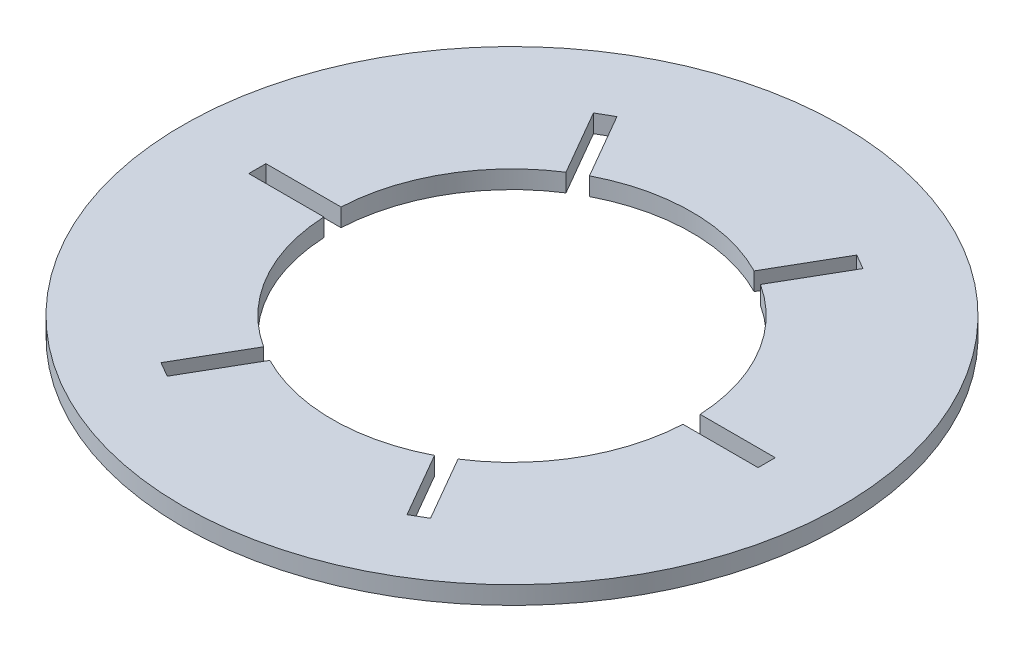
ISO-10303-21;
HEADER;
FILE_DESCRIPTION(('STEP AP214'),'2;1');
FILE_NAME('part.step','',(''),(''),'','','');
FILE_SCHEMA(('AUTOMOTIVE_DESIGN { 1 0 10303 214 1 1 1 1 }'));
ENDSEC;
DATA;
#1=APPLICATION_CONTEXT('core data for automotive mechanical design processes');
#2=APPLICATION_PROTOCOL_DEFINITION('international standard','automotive_design',2000,#1);
#3=PRODUCT_CONTEXT('',#1,'mechanical');
#4=PRODUCT('Part','Part','',(#3));
#5=PRODUCT_RELATED_PRODUCT_CATEGORY('part','',(#4));
#6=PRODUCT_DEFINITION_FORMATION('','',#4);
#7=PRODUCT_DEFINITION_CONTEXT('part definition',#1,'design');
#8=PRODUCT_DEFINITION('design','',#6,#7);
#9=PRODUCT_DEFINITION_SHAPE('','',#8);
#10=(LENGTH_UNIT() NAMED_UNIT(*) SI_UNIT(.MILLI.,.METRE.));
#11=(NAMED_UNIT(*) PLANE_ANGLE_UNIT() SI_UNIT($,.RADIAN.));
#12=(NAMED_UNIT(*) SI_UNIT($,.STERADIAN.) SOLID_ANGLE_UNIT());
#13=UNCERTAINTY_MEASURE_WITH_UNIT(LENGTH_MEASURE(1.E-05),#10,'distance_accuracy_value','');
#14=(GEOMETRIC_REPRESENTATION_CONTEXT(3) GLOBAL_UNCERTAINTY_ASSIGNED_CONTEXT((#13)) GLOBAL_UNIT_ASSIGNED_CONTEXT((#10,
#11,#12)) REPRESENTATION_CONTEXT('',''));
#15=CARTESIAN_POINT('',(0.,0.,0.));
#16=DIRECTION('',(0.,0.,1.));
#17=DIRECTION('',(1.,0.,0.));
#18=AXIS2_PLACEMENT_3D('',#15,#16,#17);
#19=CARTESIAN_POINT('',(0.,0.,0.));
#20=DIRECTION('',(0.,1.,0.));
#21=DIRECTION('',(0.,0.,1.));
#22=AXIS2_PLACEMENT_3D('',#19,#20,#21);
#23=CYLINDRICAL_SURFACE('',#22,30.);
#24=CARTESIAN_POINT('',(0.,0.,0.));
#25=DIRECTION('',(0.,1.,0.));
#26=DIRECTION('',(0.,0.,1.));
#27=AXIS2_PLACEMENT_3D('',#24,#25,#26);
#28=CIRCLE('',#27,30.);
#29=CARTESIAN_POINT('',(-16.2255764190939,0.,-25.2335227399613));
#30=VERTEX_POINT('',#29);
#31=CARTESIAN_POINT('',(-29.9656599293258,0.,-1.43499999999999));
#32=VERTEX_POINT('',#31);
#33=EDGE_CURVE('E334',#30,#32,#28,.T.);
#34=ORIENTED_EDGE('',*,*,#33,.F.);
#35=DIRECTION('',(0.,1.,0.));
#36=VECTOR('',#35,1.);
#37=CARTESIAN_POINT('',(-16.2255764190939,0.,-25.2335227399613));
#38=LINE('',#37,#36);
#39=CARTESIAN_POINT('',(-16.2255764190939,3.,-25.2335227399613));
#40=VERTEX_POINT('',#39);
#41=EDGE_CURVE('E11',#30,#40,#38,.T.);
#42=ORIENTED_EDGE('',*,*,#41,.T.);
#43=CARTESIAN_POINT('',(0.,3.,0.));
#44=DIRECTION('',(0.,1.,0.));
#45=DIRECTION('',(0.,0.,1.));
#46=AXIS2_PLACEMENT_3D('',#43,#44,#45);
#47=CIRCLE('',#46,30.);
#48=CARTESIAN_POINT('',(-29.9656599293258,3.,-1.43499999999999));
#49=VERTEX_POINT('',#48);
#50=EDGE_CURVE('E327',#40,#49,#47,.T.);
#51=ORIENTED_EDGE('',*,*,#50,.T.);
#52=DIRECTION('',(0.,1.,0.));
#53=VECTOR('',#52,1.);
#54=CARTESIAN_POINT('',(-29.9656599293258,0.,-1.43499999999999));
#55=LINE('',#54,#53);
#56=EDGE_CURVE('E342',#49,#32,#55,.F.);
#57=ORIENTED_EDGE('',*,*,#56,.T.);
#58=EDGE_LOOP('',(#34,#42,#51,#57));
#59=FACE_BOUND('',#58,.T.);
#60=ADVANCED_FACE('F33',(#59),#23,.F.);
#61=CARTESIAN_POINT('',(13.740083510232,3.,-26.6685227399617));
#62=VERTEX_POINT('',#61);
#63=CARTESIAN_POINT('',(-13.7400835102325,3.,-26.6685227399614));
#64=VERTEX_POINT('',#63);
#65=EDGE_CURVE('E378',#62,#64,#47,.T.);
#66=ORIENTED_EDGE('',*,*,#65,.T.);
#67=DIRECTION('',(0.,1.,0.));
#68=VECTOR('',#67,1.);
#69=CARTESIAN_POINT('',(-13.7400835102325,0.,-26.6685227399614));
#70=LINE('',#69,#68);
#71=CARTESIAN_POINT('',(-13.7400835102325,0.,-26.6685227399614));
#72=VERTEX_POINT('',#71);
#73=EDGE_CURVE('E41',#64,#72,#70,.F.);
#74=ORIENTED_EDGE('',*,*,#73,.T.);
#75=CARTESIAN_POINT('',(13.740083510232,0.,-26.6685227399617));
#76=VERTEX_POINT('',#75);
#77=EDGE_CURVE('E376',#76,#72,#28,.T.);
#78=ORIENTED_EDGE('',*,*,#77,.F.);
#79=DIRECTION('',(0.,1.,0.));
#80=VECTOR('',#79,1.);
#81=CARTESIAN_POINT('',(13.740083510232,0.,-26.6685227399617));
#82=LINE('',#81,#80);
#83=EDGE_CURVE('E369',#76,#62,#82,.T.);
#84=ORIENTED_EDGE('',*,*,#83,.T.);
#85=EDGE_LOOP('',(#66,#74,#78,#84));
#86=FACE_BOUND('',#85,.T.);
#87=ADVANCED_FACE('F375',(#86),#23,.F.);
#88=CARTESIAN_POINT('',(29.9656599293258,3.,-1.43500000000001));
#89=VERTEX_POINT('',#88);
#90=CARTESIAN_POINT('',(16.2255764190933,3.,-25.2335227399617));
#91=VERTEX_POINT('',#90);
#92=EDGE_CURVE('E396',#89,#91,#47,.T.);
#93=ORIENTED_EDGE('',*,*,#92,.T.);
#94=DIRECTION('',(0.,1.,0.));
#95=VECTOR('',#94,1.);
#96=CARTESIAN_POINT('',(16.2255764190933,0.,-25.2335227399617));
#97=LINE('',#96,#95);
#98=CARTESIAN_POINT('',(16.2255764190933,0.,-25.2335227399617));
#99=VERTEX_POINT('',#98);
#100=EDGE_CURVE('E367',#91,#99,#97,.F.);
#101=ORIENTED_EDGE('',*,*,#100,.T.);
#102=CARTESIAN_POINT('',(29.9656599293258,0.,-1.43500000000001));
#103=VERTEX_POINT('',#102);
#104=EDGE_CURVE('E381',#103,#99,#28,.T.);
#105=ORIENTED_EDGE('',*,*,#104,.F.);
#106=DIRECTION('',(0.,1.,0.));
#107=VECTOR('',#106,1.);
#108=CARTESIAN_POINT('',(29.9656599293258,0.,-1.43500000000001));
#109=LINE('',#108,#107);
#110=EDGE_CURVE('E364',#103,#89,#109,.T.);
#111=ORIENTED_EDGE('',*,*,#110,.T.);
#112=EDGE_LOOP('',(#93,#101,#105,#111));
#113=FACE_BOUND('',#112,.T.);
#114=ADVANCED_FACE('F430',(#113),#23,.F.);
#115=CARTESIAN_POINT('',(16.2255764190937,3.,25.2335227399614));
#116=VERTEX_POINT('',#115);
#117=CARTESIAN_POINT('',(29.9656599293258,3.,1.43499999999999));
#118=VERTEX_POINT('',#117);
#119=EDGE_CURVE('E398',#116,#118,#47,.T.);
#120=ORIENTED_EDGE('',*,*,#119,.T.);
#121=DIRECTION('',(0.,1.,0.));
#122=VECTOR('',#121,1.);
#123=CARTESIAN_POINT('',(29.9656599293258,0.,1.43499999999999));
#124=LINE('',#123,#122);
#125=CARTESIAN_POINT('',(29.9656599293258,0.,1.43499999999999));
#126=VERTEX_POINT('',#125);
#127=EDGE_CURVE('E361',#118,#126,#124,.F.);
#128=ORIENTED_EDGE('',*,*,#127,.T.);
#129=CARTESIAN_POINT('',(16.2255764190937,0.,25.2335227399614));
#130=VERTEX_POINT('',#129);
#131=EDGE_CURVE('E383',#130,#126,#28,.T.);
#132=ORIENTED_EDGE('',*,*,#131,.F.);
#133=DIRECTION('',(0.,1.,0.));
#134=VECTOR('',#133,1.);
#135=CARTESIAN_POINT('',(16.2255764190937,0.,25.2335227399614));
#136=LINE('',#135,#134);
#137=EDGE_CURVE('E358',#130,#116,#136,.T.);
#138=ORIENTED_EDGE('',*,*,#137,.T.);
#139=EDGE_LOOP('',(#120,#128,#132,#138));
#140=FACE_BOUND('',#139,.T.);
#141=ADVANCED_FACE('F417',(#140),#23,.F.);
#142=CARTESIAN_POINT('',(-13.7400835102321,3.,26.6685227399616));
#143=VERTEX_POINT('',#142);
#144=CARTESIAN_POINT('',(13.7400835102323,3.,26.6685227399615));
#145=VERTEX_POINT('',#144);
#146=EDGE_CURVE('E338',#143,#145,#47,.T.);
#147=ORIENTED_EDGE('',*,*,#146,.T.);
#148=DIRECTION('',(0.,1.,0.));
#149=VECTOR('',#148,1.);
#150=CARTESIAN_POINT('',(13.7400835102323,0.,26.6685227399615));
#151=LINE('',#150,#149);
#152=CARTESIAN_POINT('',(13.7400835102323,0.,26.6685227399615));
#153=VERTEX_POINT('',#152);
#154=EDGE_CURVE('E356',#145,#153,#151,.F.);
#155=ORIENTED_EDGE('',*,*,#154,.T.);
#156=CARTESIAN_POINT('',(-13.7400835102321,0.,26.6685227399616));
#157=VERTEX_POINT('',#156);
#158=EDGE_CURVE('E220',#157,#153,#28,.T.);
#159=ORIENTED_EDGE('',*,*,#158,.F.);
#160=DIRECTION('',(0.,1.,0.));
#161=VECTOR('',#160,1.);
#162=CARTESIAN_POINT('',(-13.7400835102321,0.,26.6685227399616));
#163=LINE('',#162,#161);
#164=EDGE_CURVE('E353',#157,#143,#163,.T.);
#165=ORIENTED_EDGE('',*,*,#164,.T.);
#166=EDGE_LOOP('',(#147,#155,#159,#165));
#167=FACE_BOUND('',#166,.T.);
#168=ADVANCED_FACE('F407',(#167),#23,.F.);
#169=CARTESIAN_POINT('',(0.,3.,0.));
#170=DIRECTION('',(0.,-1.,0.));
#171=DIRECTION('',(0.,0.,-1.));
#172=AXIS2_PLACEMENT_3D('',#169,#170,#171);
#173=CYLINDRICAL_SURFACE('',#172,55.);
#174=CARTESIAN_POINT('',(0.,3.,0.));
#175=DIRECTION('',(0.,1.,0.));
#176=DIRECTION('',(0.,0.,1.));
#177=AXIS2_PLACEMENT_3D('',#174,#175,#176);
#178=CIRCLE('',#177,55.);
#179=CARTESIAN_POINT('',(0.,3.,55.));
#180=VERTEX_POINT('',#179);
#181=EDGE_CURVE('E339',#180,#180,#178,.T.);
#182=ORIENTED_EDGE('',*,*,#181,.F.);
#183=EDGE_LOOP('',(#182));
#184=FACE_BOUND('',#183,.T.);
#185=CARTESIAN_POINT('',(0.,0.,0.));
#186=DIRECTION('',(0.,1.,0.));
#187=DIRECTION('',(0.,0.,1.));
#188=AXIS2_PLACEMENT_3D('',#185,#186,#187);
#189=CIRCLE('',#188,55.);
#190=CARTESIAN_POINT('',(0.,0.,55.));
#191=VERTEX_POINT('',#190);
#192=EDGE_CURVE('E333',#191,#191,#189,.T.);
#193=ORIENTED_EDGE('',*,*,#192,.T.);
#194=EDGE_LOOP('',(#193));
#195=FACE_BOUND('',#194,.T.);
#196=ADVANCED_FACE('F35',(#184,#195),#173,.T.);
#197=CARTESIAN_POINT('',(0.,3.,0.));
#198=DIRECTION('',(0.,1.,0.));
#199=DIRECTION('',(0.,0.,1.));
#200=AXIS2_PLACEMENT_3D('',#197,#198,#199);
#201=PLANE('',#200);
#202=DIRECTION('',(0.50000000000001,0.,0.866025403784433));
#203=VECTOR('',#202,1.);
#204=CARTESIAN_POINT('',(-22.4927464544311,3.,-36.0885796608384));
#205=LINE('',#204,#203);
#206=CARTESIAN_POINT('',(-22.4927464544311,3.,-36.0885796608384));
#207=VERTEX_POINT('',#206);
#208=EDGE_CURVE('E274',#207,#40,#205,.T.);
#209=ORIENTED_EDGE('',*,*,#208,.F.);
#210=DIRECTION('',(-0.866025403784433,0.,0.50000000000001));
#211=VECTOR('',#210,1.);
#212=CARTESIAN_POINT('',(-20.0072535455698,3.,-37.5235796608384));
#213=LINE('',#212,#211);
#214=CARTESIAN_POINT('',(-20.0072535455698,3.,-37.5235796608384));
#215=VERTEX_POINT('',#214);
#216=EDGE_CURVE('E282',#215,#207,#213,.T.);
#217=ORIENTED_EDGE('',*,*,#216,.F.);
#218=DIRECTION('',(-0.50000000000001,0.,-0.866025403784433));
#219=VECTOR('',#218,1.);
#220=CARTESIAN_POINT('',(-20.0072535455698,3.,-37.5235796608384));
#221=LINE('',#220,#219);
#222=EDGE_CURVE('E280',#64,#215,#221,.T.);
#223=ORIENTED_EDGE('',*,*,#222,.F.);
#224=ORIENTED_EDGE('',*,*,#65,.F.);
#225=DIRECTION('',(-0.499999999999992,0.,0.866025403784443));
#226=VECTOR('',#225,1.);
#227=CARTESIAN_POINT('',(20.007253545569,3.,-37.5235796608388));
#228=LINE('',#227,#226);
#229=CARTESIAN_POINT('',(20.007253545569,3.,-37.5235796608388));
#230=VERTEX_POINT('',#229);
#231=EDGE_CURVE('E255',#230,#62,#228,.T.);
#232=ORIENTED_EDGE('',*,*,#231,.F.);
#233=DIRECTION('',(-0.866025403784443,0.,-0.499999999999992));
#234=VECTOR('',#233,1.);
#235=CARTESIAN_POINT('',(22.4927464544303,3.,-36.0885796608389));
#236=LINE('',#235,#234);
#237=CARTESIAN_POINT('',(22.4927464544303,3.,-36.0885796608389));
#238=VERTEX_POINT('',#237);
#239=EDGE_CURVE('E264',#238,#230,#236,.T.);
#240=ORIENTED_EDGE('',*,*,#239,.F.);
#241=DIRECTION('',(0.499999999999992,0.,-0.866025403784443));
#242=VECTOR('',#241,1.);
#243=CARTESIAN_POINT('',(22.4927464544303,3.,-36.0885796608389));
#244=LINE('',#243,#242);
#245=EDGE_CURVE('E262',#91,#238,#244,.T.);
#246=ORIENTED_EDGE('',*,*,#245,.F.);
#247=ORIENTED_EDGE('',*,*,#92,.F.);
#248=DIRECTION('',(-1.,0.,0.));
#249=VECTOR('',#248,1.);
#250=CARTESIAN_POINT('',(42.5,3.,-1.43500000000001));
#251=LINE('',#250,#249);
#252=CARTESIAN_POINT('',(42.5,3.,-1.43500000000001));
#253=VERTEX_POINT('',#252);
#254=EDGE_CURVE('E236',#253,#89,#251,.T.);
#255=ORIENTED_EDGE('',*,*,#254,.F.);
#256=DIRECTION('',(0.,0.,-1.));
#257=VECTOR('',#256,1.);
#258=CARTESIAN_POINT('',(42.5,3.,1.43499999999999));
#259=LINE('',#258,#257);
#260=CARTESIAN_POINT('',(42.5,3.,1.43499999999999));
#261=VERTEX_POINT('',#260);
#262=EDGE_CURVE('E245',#261,#253,#259,.T.);
#263=ORIENTED_EDGE('',*,*,#262,.F.);
#264=DIRECTION('',(1.,0.,0.));
#265=VECTOR('',#264,1.);
#266=CARTESIAN_POINT('',(42.5,3.,1.43499999999999));
#267=LINE('',#266,#265);
#268=EDGE_CURVE('E243',#118,#261,#267,.T.);
#269=ORIENTED_EDGE('',*,*,#268,.F.);
#270=ORIENTED_EDGE('',*,*,#119,.F.);
#271=DIRECTION('',(-0.500000000000004,0.,-0.866025403784436));
#272=VECTOR('',#271,1.);
#273=CARTESIAN_POINT('',(22.4927464544308,3.,36.0885796608385));
#274=LINE('',#273,#272);
#275=CARTESIAN_POINT('',(22.4927464544308,3.,36.0885796608385));
#276=VERTEX_POINT('',#275);
#277=EDGE_CURVE('E221',#276,#116,#274,.T.);
#278=ORIENTED_EDGE('',*,*,#277,.F.);
#279=DIRECTION('',(0.866025403784436,0.,-0.500000000000004));
#280=VECTOR('',#279,1.);
#281=CARTESIAN_POINT('',(20.0072535455695,3.,37.5235796608385));
#282=LINE('',#281,#280);
#283=CARTESIAN_POINT('',(20.0072535455695,3.,37.5235796608385));
#284=VERTEX_POINT('',#283);
#285=EDGE_CURVE('E223',#284,#276,#282,.T.);
#286=ORIENTED_EDGE('',*,*,#285,.F.);
#287=DIRECTION('',(0.500000000000004,0.,0.866025403784436));
#288=VECTOR('',#287,1.);
#289=CARTESIAN_POINT('',(20.0072535455695,3.,37.5235796608385));
#290=LINE('',#289,#288);
#291=EDGE_CURVE('E200',#145,#284,#290,.T.);
#292=ORIENTED_EDGE('',*,*,#291,.F.);
#293=ORIENTED_EDGE('',*,*,#146,.F.);
#294=DIRECTION('',(0.499999999999998,0.,-0.86602540378444));
#295=VECTOR('',#294,1.);
#296=CARTESIAN_POINT('',(-20.0072535455692,3.,37.5235796608387));
#297=LINE('',#296,#295);
#298=CARTESIAN_POINT('',(-20.0072535455692,3.,37.5235796608387));
#299=VERTEX_POINT('',#298);
#300=EDGE_CURVE('E293',#299,#143,#297,.T.);
#301=ORIENTED_EDGE('',*,*,#300,.F.);
#302=DIRECTION('',(0.86602540378444,0.,0.499999999999998));
#303=VECTOR('',#302,1.);
#304=CARTESIAN_POINT('',(-22.4927464544306,3.,36.0885796608387));
#305=LINE('',#304,#303);
#306=CARTESIAN_POINT('',(-22.4927464544306,3.,36.0885796608387));
#307=VERTEX_POINT('',#306);
#308=EDGE_CURVE('E300',#307,#299,#305,.T.);
#309=ORIENTED_EDGE('',*,*,#308,.F.);
#310=DIRECTION('',(-0.499999999999998,0.,0.86602540378444));
#311=VECTOR('',#310,1.);
#312=CARTESIAN_POINT('',(-22.4927464544306,3.,36.0885796608387));
#313=LINE('',#312,#311);
#314=CARTESIAN_POINT('',(-16.2255764190935,3.,25.2335227399616));
#315=VERTEX_POINT('',#314);
#316=EDGE_CURVE('E230',#315,#307,#313,.T.);
#317=ORIENTED_EDGE('',*,*,#316,.F.);
#318=CARTESIAN_POINT('',(-29.9656599293258,3.,1.43500000000001));
#319=VERTEX_POINT('',#318);
#320=EDGE_CURVE('E335',#319,#315,#47,.T.);
#321=ORIENTED_EDGE('',*,*,#320,.F.);
#322=DIRECTION('',(1.,0.,0.));
#323=VECTOR('',#322,1.);
#324=CARTESIAN_POINT('',(-42.5,3.,1.43500000000001));
#325=LINE('',#324,#323);
#326=CARTESIAN_POINT('',(-42.5,3.,1.43500000000001));
#327=VERTEX_POINT('',#326);
#328=EDGE_CURVE('E313',#327,#319,#325,.T.);
#329=ORIENTED_EDGE('',*,*,#328,.F.);
#330=DIRECTION('',(0.,0.,1.));
#331=VECTOR('',#330,1.);
#332=CARTESIAN_POINT('',(-42.5,3.,-1.43499999999999));
#333=LINE('',#332,#331);
#334=CARTESIAN_POINT('',(-42.5,3.,-1.43499999999999));
#335=VERTEX_POINT('',#334);
#336=EDGE_CURVE('E321',#335,#327,#333,.T.);
#337=ORIENTED_EDGE('',*,*,#336,.F.);
#338=DIRECTION('',(-1.,0.,0.));
#339=VECTOR('',#338,1.);
#340=CARTESIAN_POINT('',(-42.5,3.,-1.43499999999999));
#341=LINE('',#340,#339);
#342=EDGE_CURVE('E306',#49,#335,#341,.T.);
#343=ORIENTED_EDGE('',*,*,#342,.F.);
#344=ORIENTED_EDGE('',*,*,#50,.F.);
#345=EDGE_LOOP('',(#209,#217,#223,#224,#232,#240,#246,#247,#255,#263,#269,#270,#278,#286,#292,
#293,#301,#309,#317,#321,#329,#337,#343,#344));
#346=FACE_BOUND('',#345,.T.);
#347=ORIENTED_EDGE('',*,*,#181,.T.);
#348=EDGE_LOOP('',(#347));
#349=FACE_BOUND('',#348,.T.);
#350=ADVANCED_FACE('F409',(#346,#349),#201,.T.);
#351=CARTESIAN_POINT('',(0.,0.,0.));
#352=DIRECTION('',(0.,1.,0.));
#353=DIRECTION('',(0.,0.,1.));
#354=AXIS2_PLACEMENT_3D('',#351,#352,#353);
#355=PLANE('',#354);
#356=DIRECTION('',(-0.866025403784433,0.,0.50000000000001));
#357=VECTOR('',#356,1.);
#358=CARTESIAN_POINT('',(-20.0072535455698,0.,-37.5235796608384));
#359=LINE('',#358,#357);
#360=CARTESIAN_POINT('',(-20.0072535455698,0.,-37.5235796608384));
#361=VERTEX_POINT('',#360);
#362=CARTESIAN_POINT('',(-22.4927464544311,0.,-36.0885796608384));
#363=VERTEX_POINT('',#362);
#364=EDGE_CURVE('E273',#361,#363,#359,.T.);
#365=ORIENTED_EDGE('',*,*,#364,.T.);
#366=DIRECTION('',(0.50000000000001,0.,0.866025403784433));
#367=VECTOR('',#366,1.);
#368=CARTESIAN_POINT('',(-22.4927464544311,0.,-36.0885796608384));
#369=LINE('',#368,#367);
#370=EDGE_CURVE('E276',#363,#30,#369,.T.);
#371=ORIENTED_EDGE('',*,*,#370,.T.);
#372=ORIENTED_EDGE('',*,*,#33,.T.);
#373=DIRECTION('',(-1.,0.,0.));
#374=VECTOR('',#373,1.);
#375=CARTESIAN_POINT('',(-42.5,0.,-1.43499999999999));
#376=LINE('',#375,#374);
#377=CARTESIAN_POINT('',(-42.5,0.,-1.43499999999999));
#378=VERTEX_POINT('',#377);
#379=EDGE_CURVE('E309',#32,#378,#376,.T.);
#380=ORIENTED_EDGE('',*,*,#379,.T.);
#381=DIRECTION('',(0.,0.,1.));
#382=VECTOR('',#381,1.);
#383=CARTESIAN_POINT('',(-42.5,0.,-1.43499999999999));
#384=LINE('',#383,#382);
#385=CARTESIAN_POINT('',(-42.5,0.,1.43500000000001));
#386=VERTEX_POINT('',#385);
#387=EDGE_CURVE('E312',#378,#386,#384,.T.);
#388=ORIENTED_EDGE('',*,*,#387,.T.);
#389=DIRECTION('',(1.,0.,0.));
#390=VECTOR('',#389,1.);
#391=CARTESIAN_POINT('',(-42.5,0.,1.43500000000001));
#392=LINE('',#391,#390);
#393=CARTESIAN_POINT('',(-29.9656599293258,0.,1.43500000000001));
#394=VERTEX_POINT('',#393);
#395=EDGE_CURVE('E316',#386,#394,#392,.T.);
#396=ORIENTED_EDGE('',*,*,#395,.T.);
#397=CARTESIAN_POINT('',(-16.2255764190935,0.,25.2335227399616));
#398=VERTEX_POINT('',#397);
#399=EDGE_CURVE('E330',#394,#398,#28,.T.);
#400=ORIENTED_EDGE('',*,*,#399,.T.);
#401=DIRECTION('',(-0.499999999999998,0.,0.86602540378444));
#402=VECTOR('',#401,1.);
#403=CARTESIAN_POINT('',(-22.4927464544306,0.,36.0885796608387));
#404=LINE('',#403,#402);
#405=CARTESIAN_POINT('',(-22.4927464544306,0.,36.0885796608387));
#406=VERTEX_POINT('',#405);
#407=EDGE_CURVE('E289',#398,#406,#404,.T.);
#408=ORIENTED_EDGE('',*,*,#407,.T.);
#409=DIRECTION('',(0.86602540378444,0.,0.499999999999998));
#410=VECTOR('',#409,1.);
#411=CARTESIAN_POINT('',(-22.4927464544306,0.,36.0885796608387));
#412=LINE('',#411,#410);
#413=CARTESIAN_POINT('',(-20.0072535455692,0.,37.5235796608387));
#414=VERTEX_POINT('',#413);
#415=EDGE_CURVE('E292',#406,#414,#412,.T.);
#416=ORIENTED_EDGE('',*,*,#415,.T.);
#417=DIRECTION('',(0.499999999999998,0.,-0.86602540378444));
#418=VECTOR('',#417,1.);
#419=CARTESIAN_POINT('',(-20.0072535455692,0.,37.5235796608387));
#420=LINE('',#419,#418);
#421=EDGE_CURVE('E296',#414,#157,#420,.T.);
#422=ORIENTED_EDGE('',*,*,#421,.T.);
#423=ORIENTED_EDGE('',*,*,#158,.T.);
#424=DIRECTION('',(0.500000000000004,0.,0.866025403784436));
#425=VECTOR('',#424,1.);
#426=CARTESIAN_POINT('',(20.0072535455695,0.,37.5235796608385));
#427=LINE('',#426,#425);
#428=CARTESIAN_POINT('',(20.0072535455695,0.,37.5235796608385));
#429=VERTEX_POINT('',#428);
#430=EDGE_CURVE('E197',#153,#429,#427,.T.);
#431=ORIENTED_EDGE('',*,*,#430,.T.);
#432=DIRECTION('',(0.866025403784436,0.,-0.500000000000004));
#433=VECTOR('',#432,1.);
#434=CARTESIAN_POINT('',(20.0072535455695,0.,37.5235796608385));
#435=LINE('',#434,#433);
#436=CARTESIAN_POINT('',(22.4927464544308,0.,36.0885796608385));
#437=VERTEX_POINT('',#436);
#438=EDGE_CURVE('E208',#429,#437,#435,.T.);
#439=ORIENTED_EDGE('',*,*,#438,.T.);
#440=DIRECTION('',(-0.500000000000004,0.,-0.866025403784436));
#441=VECTOR('',#440,1.);
#442=CARTESIAN_POINT('',(22.4927464544308,0.,36.0885796608385));
#443=LINE('',#442,#441);
#444=EDGE_CURVE('E205',#437,#130,#443,.T.);
#445=ORIENTED_EDGE('',*,*,#444,.T.);
#446=ORIENTED_EDGE('',*,*,#131,.T.);
#447=DIRECTION('',(1.,0.,0.));
#448=VECTOR('',#447,1.);
#449=CARTESIAN_POINT('',(42.5,0.,1.43499999999999));
#450=LINE('',#449,#448);
#451=CARTESIAN_POINT('',(42.5,0.,1.43499999999999));
#452=VERTEX_POINT('',#451);
#453=EDGE_CURVE('E232',#126,#452,#450,.T.);
#454=ORIENTED_EDGE('',*,*,#453,.T.);
#455=DIRECTION('',(0.,0.,-1.));
#456=VECTOR('',#455,1.);
#457=CARTESIAN_POINT('',(42.5,0.,1.43499999999999));
#458=LINE('',#457,#456);
#459=CARTESIAN_POINT('',(42.5,0.,-1.43500000000001));
#460=VERTEX_POINT('',#459);
#461=EDGE_CURVE('E235',#452,#460,#458,.T.);
#462=ORIENTED_EDGE('',*,*,#461,.T.);
#463=DIRECTION('',(-1.,0.,0.));
#464=VECTOR('',#463,1.);
#465=CARTESIAN_POINT('',(42.5,0.,-1.43500000000001));
#466=LINE('',#465,#464);
#467=EDGE_CURVE('E239',#460,#103,#466,.T.);
#468=ORIENTED_EDGE('',*,*,#467,.T.);
#469=ORIENTED_EDGE('',*,*,#104,.T.);
#470=DIRECTION('',(0.499999999999992,0.,-0.866025403784443));
#471=VECTOR('',#470,1.);
#472=CARTESIAN_POINT('',(22.4927464544303,0.,-36.0885796608389));
#473=LINE('',#472,#471);
#474=CARTESIAN_POINT('',(22.4927464544303,0.,-36.0885796608389));
#475=VERTEX_POINT('',#474);
#476=EDGE_CURVE('E56',#99,#475,#473,.T.);
#477=ORIENTED_EDGE('',*,*,#476,.T.);
#478=DIRECTION('',(-0.866025403784443,0.,-0.499999999999992));
#479=VECTOR('',#478,1.);
#480=CARTESIAN_POINT('',(22.4927464544303,0.,-36.0885796608389));
#481=LINE('',#480,#479);
#482=CARTESIAN_POINT('',(20.007253545569,0.,-37.5235796608388));
#483=VERTEX_POINT('',#482);
#484=EDGE_CURVE('E254',#475,#483,#481,.T.);
#485=ORIENTED_EDGE('',*,*,#484,.T.);
#486=DIRECTION('',(-0.499999999999992,0.,0.866025403784443));
#487=VECTOR('',#486,1.);
#488=CARTESIAN_POINT('',(20.007253545569,0.,-37.5235796608388));
#489=LINE('',#488,#487);
#490=EDGE_CURVE('E258',#483,#76,#489,.T.);
#491=ORIENTED_EDGE('',*,*,#490,.T.);
#492=ORIENTED_EDGE('',*,*,#77,.T.);
#493=DIRECTION('',(-0.50000000000001,0.,-0.866025403784433));
#494=VECTOR('',#493,1.);
#495=CARTESIAN_POINT('',(-20.0072535455698,0.,-37.5235796608384));
#496=LINE('',#495,#494);
#497=EDGE_CURVE('E48',#72,#361,#496,.T.);
#498=ORIENTED_EDGE('',*,*,#497,.T.);
#499=EDGE_LOOP('',(#365,#371,#372,#380,#388,#396,#400,#408,#416,#422,#423,#431,#439,#445,#446,
#454,#462,#468,#469,#477,#485,#491,#492,#498));
#500=FACE_BOUND('',#499,.T.);
#501=ORIENTED_EDGE('',*,*,#192,.F.);
#502=EDGE_LOOP('',(#501));
#503=FACE_BOUND('',#502,.T.);
#504=ADVANCED_FACE('F216',(#500,#503),#355,.F.);
#505=ORIENTED_EDGE('',*,*,#320,.T.);
#506=DIRECTION('',(0.,1.,0.));
#507=VECTOR('',#506,1.);
#508=CARTESIAN_POINT('',(-16.2255764190935,0.,25.2335227399616));
#509=LINE('',#508,#507);
#510=EDGE_CURVE('E350',#315,#398,#509,.F.);
#511=ORIENTED_EDGE('',*,*,#510,.T.);
#512=ORIENTED_EDGE('',*,*,#399,.F.);
#513=DIRECTION('',(0.,1.,0.));
#514=VECTOR('',#513,1.);
#515=CARTESIAN_POINT('',(-29.9656599293258,0.,1.43500000000001));
#516=LINE('',#515,#514);
#517=EDGE_CURVE('E347',#394,#319,#516,.T.);
#518=ORIENTED_EDGE('',*,*,#517,.T.);
#519=EDGE_LOOP('',(#505,#511,#512,#518));
#520=FACE_BOUND('',#519,.T.);
#521=ADVANCED_FACE('F459',(#520),#23,.F.);
#522=CARTESIAN_POINT('',(-42.5,0.,1.43500000000001));
#523=DIRECTION('',(0.,0.,1.));
#524=DIRECTION('',(1.,0.,0.));
#525=AXIS2_PLACEMENT_3D('',#522,#523,#524);
#526=PLANE('',#525);
#527=ORIENTED_EDGE('',*,*,#395,.F.);
#528=DIRECTION('',(0.,1.,0.));
#529=VECTOR('',#528,1.);
#530=CARTESIAN_POINT('',(-42.5,0.,1.43500000000001));
#531=LINE('',#530,#529);
#532=EDGE_CURVE('E325',#386,#327,#531,.T.);
#533=ORIENTED_EDGE('',*,*,#532,.T.);
#534=ORIENTED_EDGE('',*,*,#328,.T.);
#535=ORIENTED_EDGE('',*,*,#517,.F.);
#536=EDGE_LOOP('',(#527,#533,#534,#535));
#537=FACE_BOUND('',#536,.T.);
#538=ADVANCED_FACE('F466',(#537),#526,.F.);
#539=CARTESIAN_POINT('',(-42.5,0.,-1.43499999999999));
#540=DIRECTION('',(0.,0.,-1.));
#541=DIRECTION('',(-1.,0.,0.));
#542=AXIS2_PLACEMENT_3D('',#539,#540,#541);
#543=PLANE('',#542);
#544=ORIENTED_EDGE('',*,*,#342,.T.);
#545=DIRECTION('',(0.,1.,0.));
#546=VECTOR('',#545,1.);
#547=CARTESIAN_POINT('',(-42.5,0.,-1.43499999999999));
#548=LINE('',#547,#546);
#549=EDGE_CURVE('E319',#378,#335,#548,.T.);
#550=ORIENTED_EDGE('',*,*,#549,.F.);
#551=ORIENTED_EDGE('',*,*,#379,.F.);
#552=ORIENTED_EDGE('',*,*,#56,.F.);
#553=EDGE_LOOP('',(#544,#550,#551,#552));
#554=FACE_BOUND('',#553,.T.);
#555=ADVANCED_FACE('F390',(#554),#543,.F.);
#556=CARTESIAN_POINT('',(-42.5,0.,-1.43499999999999));
#557=DIRECTION('',(-1.,0.,0.));
#558=DIRECTION('',(0.,0.,1.));
#559=AXIS2_PLACEMENT_3D('',#556,#557,#558);
#560=PLANE('',#559);
#561=ORIENTED_EDGE('',*,*,#336,.T.);
#562=ORIENTED_EDGE('',*,*,#532,.F.);
#563=ORIENTED_EDGE('',*,*,#387,.F.);
#564=ORIENTED_EDGE('',*,*,#549,.T.);
#565=EDGE_LOOP('',(#561,#562,#563,#564));
#566=FACE_BOUND('',#565,.T.);
#567=ADVANCED_FACE('F499',(#566),#560,.F.);
#568=CARTESIAN_POINT('',(-20.0072535455692,0.,37.5235796608387));
#569=DIRECTION('',(0.86602540378444,0.,0.499999999999998));
#570=DIRECTION('',(0.499999999999998,0.,-0.86602540378444));
#571=AXIS2_PLACEMENT_3D('',#568,#569,#570);
#572=PLANE('',#571);
#573=ORIENTED_EDGE('',*,*,#421,.F.);
#574=DIRECTION('',(0.,1.,0.));
#575=VECTOR('',#574,1.);
#576=CARTESIAN_POINT('',(-20.0072535455692,0.,37.5235796608387));
#577=LINE('',#576,#575);
#578=EDGE_CURVE('E304',#414,#299,#577,.T.);
#579=ORIENTED_EDGE('',*,*,#578,.T.);
#580=ORIENTED_EDGE('',*,*,#300,.T.);
#581=ORIENTED_EDGE('',*,*,#164,.F.);
#582=EDGE_LOOP('',(#573,#579,#580,#581));
#583=FACE_BOUND('',#582,.T.);
#584=ADVANCED_FACE('F504',(#583),#572,.F.);
#585=CARTESIAN_POINT('',(-22.4927464544306,0.,36.0885796608387));
#586=DIRECTION('',(-0.86602540378444,0.,-0.499999999999998));
#587=DIRECTION('',(-0.499999999999998,0.,0.86602540378444));
#588=AXIS2_PLACEMENT_3D('',#585,#586,#587);
#589=PLANE('',#588);
#590=ORIENTED_EDGE('',*,*,#316,.T.);
#591=DIRECTION('',(0.,1.,0.));
#592=VECTOR('',#591,1.);
#593=CARTESIAN_POINT('',(-22.4927464544306,0.,36.0885796608387));
#594=LINE('',#593,#592);
#595=EDGE_CURVE('E298',#406,#307,#594,.T.);
#596=ORIENTED_EDGE('',*,*,#595,.F.);
#597=ORIENTED_EDGE('',*,*,#407,.F.);
#598=ORIENTED_EDGE('',*,*,#510,.F.);
#599=EDGE_LOOP('',(#590,#596,#597,#598));
#600=FACE_BOUND('',#599,.T.);
#601=ADVANCED_FACE('F548',(#600),#589,.F.);
#602=CARTESIAN_POINT('',(-22.4927464544306,0.,36.0885796608387));
#603=DIRECTION('',(-0.499999999999998,0.,0.86602540378444));
#604=DIRECTION('',(0.86602540378444,0.,0.499999999999998));
#605=AXIS2_PLACEMENT_3D('',#602,#603,#604);
#606=PLANE('',#605);
#607=ORIENTED_EDGE('',*,*,#308,.T.);
#608=ORIENTED_EDGE('',*,*,#578,.F.);
#609=ORIENTED_EDGE('',*,*,#415,.F.);
#610=ORIENTED_EDGE('',*,*,#595,.T.);
#611=EDGE_LOOP('',(#607,#608,#609,#610));
#612=FACE_BOUND('',#611,.T.);
#613=ADVANCED_FACE('F558',(#612),#606,.F.);
#614=CARTESIAN_POINT('',(22.4927464544308,0.,36.0885796608385));
#615=DIRECTION('',(0.866025403784436,0.,-0.500000000000004));
#616=DIRECTION('',(-0.500000000000004,0.,-0.866025403784436));
#617=AXIS2_PLACEMENT_3D('',#614,#615,#616);
#618=PLANE('',#617);
#619=ORIENTED_EDGE('',*,*,#444,.F.);
#620=DIRECTION('',(0.,1.,0.));
#621=VECTOR('',#620,1.);
#622=CARTESIAN_POINT('',(22.4927464544308,0.,36.0885796608385));
#623=LINE('',#622,#621);
#624=EDGE_CURVE('E204',#437,#276,#623,.T.);
#625=ORIENTED_EDGE('',*,*,#624,.T.);
#626=ORIENTED_EDGE('',*,*,#277,.T.);
#627=ORIENTED_EDGE('',*,*,#137,.F.);
#628=EDGE_LOOP('',(#619,#625,#626,#627));
#629=FACE_BOUND('',#628,.T.);
#630=ADVANCED_FACE('F415',(#629),#618,.F.);
#631=CARTESIAN_POINT('',(20.0072535455695,0.,37.5235796608385));
#632=DIRECTION('',(-0.866025403784436,0.,0.500000000000004));
#633=DIRECTION('',(0.500000000000004,0.,0.866025403784436));
#634=AXIS2_PLACEMENT_3D('',#631,#632,#633);
#635=PLANE('',#634);
#636=ORIENTED_EDGE('',*,*,#291,.T.);
#637=DIRECTION('',(0.,1.,0.));
#638=VECTOR('',#637,1.);
#639=CARTESIAN_POINT('',(20.0072535455695,0.,37.5235796608385));
#640=LINE('',#639,#638);
#641=EDGE_CURVE('E193',#429,#284,#640,.T.);
#642=ORIENTED_EDGE('',*,*,#641,.F.);
#643=ORIENTED_EDGE('',*,*,#430,.F.);
#644=ORIENTED_EDGE('',*,*,#154,.F.);
#645=EDGE_LOOP('',(#636,#642,#643,#644));
#646=FACE_BOUND('',#645,.T.);
#647=ADVANCED_FACE('F195',(#646),#635,.F.);
#648=CARTESIAN_POINT('',(20.0072535455695,0.,37.5235796608385));
#649=DIRECTION('',(0.500000000000004,0.,0.866025403784436));
#650=DIRECTION('',(0.866025403784436,0.,-0.500000000000004));
#651=AXIS2_PLACEMENT_3D('',#648,#649,#650);
#652=PLANE('',#651);
#653=ORIENTED_EDGE('',*,*,#285,.T.);
#654=ORIENTED_EDGE('',*,*,#624,.F.);
#655=ORIENTED_EDGE('',*,*,#438,.F.);
#656=ORIENTED_EDGE('',*,*,#641,.T.);
#657=EDGE_LOOP('',(#653,#654,#655,#656));
#658=FACE_BOUND('',#657,.T.);
#659=ADVANCED_FACE('F209',(#658),#652,.F.);
#660=CARTESIAN_POINT('',(42.5,0.,-1.43500000000001));
#661=DIRECTION('',(0.,0.,-1.));
#662=DIRECTION('',(-1.,0.,0.));
#663=AXIS2_PLACEMENT_3D('',#660,#661,#662);
#664=PLANE('',#663);
#665=ORIENTED_EDGE('',*,*,#467,.F.);
#666=DIRECTION('',(0.,1.,0.));
#667=VECTOR('',#666,1.);
#668=CARTESIAN_POINT('',(42.5,0.,-1.43500000000001));
#669=LINE('',#668,#667);
#670=EDGE_CURVE('E228',#460,#253,#669,.T.);
#671=ORIENTED_EDGE('',*,*,#670,.T.);
#672=ORIENTED_EDGE('',*,*,#254,.T.);
#673=ORIENTED_EDGE('',*,*,#110,.F.);
#674=EDGE_LOOP('',(#665,#671,#672,#673));
#675=FACE_BOUND('',#674,.T.);
#676=ADVANCED_FACE('F428',(#675),#664,.F.);
#677=CARTESIAN_POINT('',(42.5,0.,1.43499999999999));
#678=DIRECTION('',(0.,0.,1.));
#679=DIRECTION('',(1.,0.,0.));
#680=AXIS2_PLACEMENT_3D('',#677,#678,#679);
#681=PLANE('',#680);
#682=ORIENTED_EDGE('',*,*,#268,.T.);
#683=DIRECTION('',(0.,1.,0.));
#684=VECTOR('',#683,1.);
#685=CARTESIAN_POINT('',(42.5,0.,1.43499999999999));
#686=LINE('',#685,#684);
#687=EDGE_CURVE('E242',#452,#261,#686,.T.);
#688=ORIENTED_EDGE('',*,*,#687,.F.);
#689=ORIENTED_EDGE('',*,*,#453,.F.);
#690=ORIENTED_EDGE('',*,*,#127,.F.);
#691=EDGE_LOOP('',(#682,#688,#689,#690));
#692=FACE_BOUND('',#691,.T.);
#693=ADVANCED_FACE('F421',(#692),#681,.F.);
#694=CARTESIAN_POINT('',(42.5,0.,1.43499999999999));
#695=DIRECTION('',(1.,0.,0.));
#696=DIRECTION('',(0.,0.,-1.));
#697=AXIS2_PLACEMENT_3D('',#694,#695,#696);
#698=PLANE('',#697);
#699=ORIENTED_EDGE('',*,*,#262,.T.);
#700=ORIENTED_EDGE('',*,*,#670,.F.);
#701=ORIENTED_EDGE('',*,*,#461,.F.);
#702=ORIENTED_EDGE('',*,*,#687,.T.);
#703=EDGE_LOOP('',(#699,#700,#701,#702));
#704=FACE_BOUND('',#703,.T.);
#705=ADVANCED_FACE('F424',(#704),#698,.F.);
#706=CARTESIAN_POINT('',(20.007253545569,0.,-37.5235796608388));
#707=DIRECTION('',(-0.866025403784443,0.,-0.499999999999992));
#708=DIRECTION('',(-0.499999999999992,0.,0.866025403784443));
#709=AXIS2_PLACEMENT_3D('',#706,#707,#708);
#710=PLANE('',#709);
#711=ORIENTED_EDGE('',*,*,#490,.F.);
#712=DIRECTION('',(0.,1.,0.));
#713=VECTOR('',#712,1.);
#714=CARTESIAN_POINT('',(20.007253545569,0.,-37.5235796608388));
#715=LINE('',#714,#713);
#716=EDGE_CURVE('E246',#483,#230,#715,.T.);
#717=ORIENTED_EDGE('',*,*,#716,.T.);
#718=ORIENTED_EDGE('',*,*,#231,.T.);
#719=ORIENTED_EDGE('',*,*,#83,.F.);
#720=EDGE_LOOP('',(#711,#717,#718,#719));
#721=FACE_BOUND('',#720,.T.);
#722=ADVANCED_FACE('F439',(#721),#710,.F.);
#723=CARTESIAN_POINT('',(22.4927464544303,0.,-36.0885796608389));
#724=DIRECTION('',(0.866025403784443,0.,0.499999999999992));
#725=DIRECTION('',(0.499999999999992,0.,-0.866025403784443));
#726=AXIS2_PLACEMENT_3D('',#723,#724,#725);
#727=PLANE('',#726);
#728=ORIENTED_EDGE('',*,*,#245,.T.);
#729=DIRECTION('',(0.,1.,0.));
#730=VECTOR('',#729,1.);
#731=CARTESIAN_POINT('',(22.4927464544303,0.,-36.0885796608389));
#732=LINE('',#731,#730);
#733=EDGE_CURVE('E261',#475,#238,#732,.T.);
#734=ORIENTED_EDGE('',*,*,#733,.F.);
#735=ORIENTED_EDGE('',*,*,#476,.F.);
#736=ORIENTED_EDGE('',*,*,#100,.F.);
#737=EDGE_LOOP('',(#728,#734,#735,#736));
#738=FACE_BOUND('',#737,.T.);
#739=ADVANCED_FACE('F432',(#738),#727,.F.);
#740=CARTESIAN_POINT('',(22.4927464544303,0.,-36.0885796608389));
#741=DIRECTION('',(0.499999999999992,0.,-0.866025403784443));
#742=DIRECTION('',(-0.866025403784443,0.,-0.499999999999992));
#743=AXIS2_PLACEMENT_3D('',#740,#741,#742);
#744=PLANE('',#743);
#745=ORIENTED_EDGE('',*,*,#239,.T.);
#746=ORIENTED_EDGE('',*,*,#716,.F.);
#747=ORIENTED_EDGE('',*,*,#484,.F.);
#748=ORIENTED_EDGE('',*,*,#733,.T.);
#749=EDGE_LOOP('',(#745,#746,#747,#748));
#750=FACE_BOUND('',#749,.T.);
#751=ADVANCED_FACE('F436',(#750),#744,.F.);
#752=CARTESIAN_POINT('',(-22.4927464544311,0.,-36.0885796608384));
#753=DIRECTION('',(-0.866025403784433,0.,0.50000000000001));
#754=DIRECTION('',(0.50000000000001,0.,0.866025403784433));
#755=AXIS2_PLACEMENT_3D('',#752,#753,#754);
#756=PLANE('',#755);
#757=ORIENTED_EDGE('',*,*,#370,.F.);
#758=DIRECTION('',(0.,1.,0.));
#759=VECTOR('',#758,1.);
#760=CARTESIAN_POINT('',(-22.4927464544311,0.,-36.0885796608384));
#761=LINE('',#760,#759);
#762=EDGE_CURVE('E265',#363,#207,#761,.T.);
#763=ORIENTED_EDGE('',*,*,#762,.T.);
#764=ORIENTED_EDGE('',*,*,#208,.T.);
#765=ORIENTED_EDGE('',*,*,#41,.F.);
#766=EDGE_LOOP('',(#757,#763,#764,#765));
#767=FACE_BOUND('',#766,.T.);
#768=ADVANCED_FACE('F446',(#767),#756,.F.);
#769=CARTESIAN_POINT('',(-20.0072535455698,0.,-37.5235796608384));
#770=DIRECTION('',(0.866025403784433,0.,-0.50000000000001));
#771=DIRECTION('',(-0.50000000000001,0.,-0.866025403784433));
#772=AXIS2_PLACEMENT_3D('',#769,#770,#771);
#773=PLANE('',#772);
#774=ORIENTED_EDGE('',*,*,#222,.T.);
#775=DIRECTION('',(0.,1.,0.));
#776=VECTOR('',#775,1.);
#777=CARTESIAN_POINT('',(-20.0072535455698,0.,-37.5235796608384));
#778=LINE('',#777,#776);
#779=EDGE_CURVE('E279',#361,#215,#778,.T.);
#780=ORIENTED_EDGE('',*,*,#779,.F.);
#781=ORIENTED_EDGE('',*,*,#497,.F.);
#782=ORIENTED_EDGE('',*,*,#73,.F.);
#783=EDGE_LOOP('',(#774,#780,#781,#782));
#784=FACE_BOUND('',#783,.T.);
#785=ADVANCED_FACE('F441',(#784),#773,.F.);
#786=CARTESIAN_POINT('',(-20.0072535455698,0.,-37.5235796608384));
#787=DIRECTION('',(-0.50000000000001,0.,-0.866025403784433));
#788=DIRECTION('',(-0.866025403784433,0.,0.50000000000001));
#789=AXIS2_PLACEMENT_3D('',#786,#787,#788);
#790=PLANE('',#789);
#791=ORIENTED_EDGE('',*,*,#216,.T.);
#792=ORIENTED_EDGE('',*,*,#762,.F.);
#793=ORIENTED_EDGE('',*,*,#364,.F.);
#794=ORIENTED_EDGE('',*,*,#779,.T.);
#795=EDGE_LOOP('',(#791,#792,#793,#794));
#796=FACE_BOUND('',#795,.T.);
#797=ADVANCED_FACE('F444',(#796),#790,.F.);
#798=CLOSED_SHELL('',(#60,#87,#114,#141,#168,#196,#350,#504,#521,#538,#555,#567,#584,#601,#613,
#630,#647,#659,#676,#693,#705,#722,#739,#751,#768,#785,#797));
#799=MANIFOLD_SOLID_BREP('B2',#798);
#800=ADVANCED_BREP_SHAPE_REPRESENTATION('',(#18,#799),#14);
#801=SHAPE_DEFINITION_REPRESENTATION(#9,#800);
ENDSEC;
END-ISO-10303-21;
